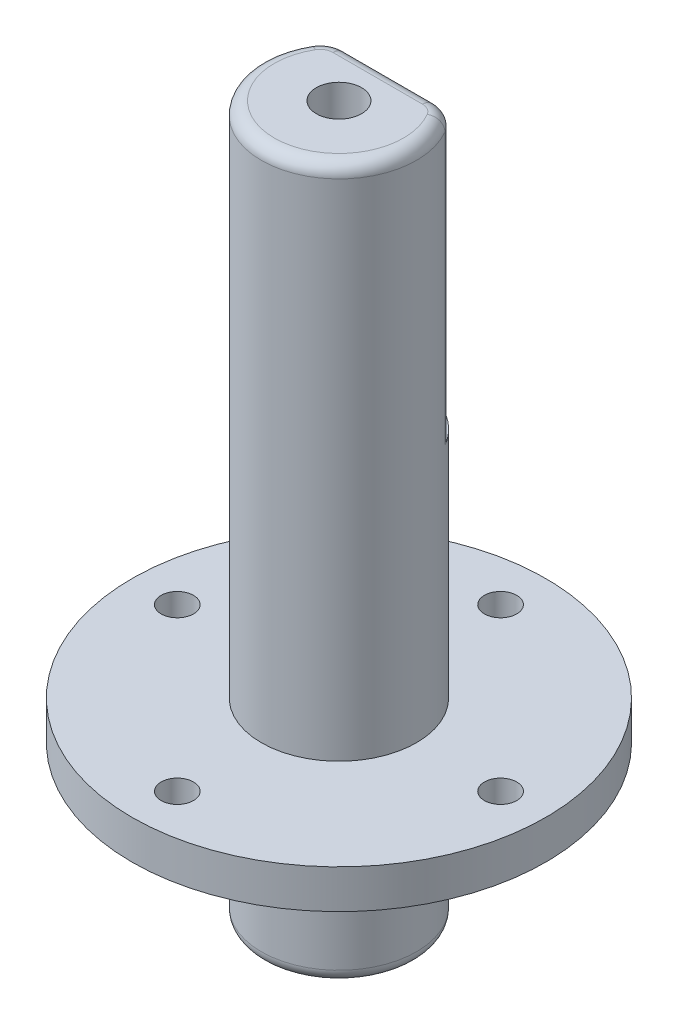
ISO-10303-21;
HEADER;
FILE_DESCRIPTION(('STEP AP214'),'2;1');
FILE_NAME('part.step','',(''),(''),'','','');
FILE_SCHEMA(('AUTOMOTIVE_DESIGN { 1 0 10303 214 1 1 1 1 }'));
ENDSEC;
DATA;
#1=APPLICATION_CONTEXT('core data for automotive mechanical design processes');
#2=APPLICATION_PROTOCOL_DEFINITION('international standard','automotive_design',2000,#1);
#3=PRODUCT_CONTEXT('',#1,'mechanical');
#4=PRODUCT('Part','Part','',(#3));
#5=PRODUCT_RELATED_PRODUCT_CATEGORY('part','',(#4));
#6=PRODUCT_DEFINITION_FORMATION('','',#4);
#7=PRODUCT_DEFINITION_CONTEXT('part definition',#1,'design');
#8=PRODUCT_DEFINITION('design','',#6,#7);
#9=PRODUCT_DEFINITION_SHAPE('','',#8);
#10=(LENGTH_UNIT() NAMED_UNIT(*) SI_UNIT(.MILLI.,.METRE.));
#11=(NAMED_UNIT(*) PLANE_ANGLE_UNIT() SI_UNIT($,.RADIAN.));
#12=(NAMED_UNIT(*) SI_UNIT($,.STERADIAN.) SOLID_ANGLE_UNIT());
#13=UNCERTAINTY_MEASURE_WITH_UNIT(LENGTH_MEASURE(1.E-05),#10,'distance_accuracy_value','');
#14=(GEOMETRIC_REPRESENTATION_CONTEXT(3) GLOBAL_UNCERTAINTY_ASSIGNED_CONTEXT((#13)) GLOBAL_UNIT_ASSIGNED_CONTEXT((#10,
#11,#12)) REPRESENTATION_CONTEXT('',''));
#15=CARTESIAN_POINT('',(0.,0.,0.));
#16=DIRECTION('',(0.,0.,1.));
#17=DIRECTION('',(1.,0.,0.));
#18=AXIS2_PLACEMENT_3D('',#15,#16,#17);
#19=CARTESIAN_POINT('',(0.,10.,0.));
#20=DIRECTION('',(0.,-1.,0.));
#21=DIRECTION('',(0.,0.,-1.));
#22=AXIS2_PLACEMENT_3D('',#19,#20,#21);
#23=CYLINDRICAL_SURFACE('',#22,6.);
#24=CARTESIAN_POINT('',(0.,0.999999999999999,0.));
#25=DIRECTION('',(0.,1.,0.));
#26=DIRECTION('',(0.,0.,1.));
#27=AXIS2_PLACEMENT_3D('',#24,#25,#26);
#28=CIRCLE('',#27,6.);
#29=CARTESIAN_POINT('',(0.,0.999999999999999,6.));
#30=VERTEX_POINT('',#29);
#31=EDGE_CURVE('E171',#30,#30,#28,.T.);
#32=ORIENTED_EDGE('',*,*,#31,.T.);
#33=EDGE_LOOP('',(#32));
#34=FACE_BOUND('',#33,.T.);
#35=CARTESIAN_POINT('',(0.,10.,0.));
#36=DIRECTION('',(0.,1.,0.));
#37=DIRECTION('',(0.,0.,1.));
#38=AXIS2_PLACEMENT_3D('',#35,#36,#37);
#39=CIRCLE('',#38,6.);
#40=CARTESIAN_POINT('',(0.,10.,6.));
#41=VERTEX_POINT('',#40);
#42=EDGE_CURVE('E172',#41,#41,#39,.T.);
#43=ORIENTED_EDGE('',*,*,#42,.F.);
#44=EDGE_LOOP('',(#43));
#45=FACE_BOUND('',#44,.T.);
#46=ADVANCED_FACE('F35',(#34,#45),#23,.T.);
#47=CARTESIAN_POINT('',(0.,0.,0.));
#48=DIRECTION('',(0.,1.,0.));
#49=DIRECTION('',(0.,0.,1.));
#50=AXIS2_PLACEMENT_3D('',#47,#48,#49);
#51=PLANE('',#50);
#52=CARTESIAN_POINT('',(0.,0.,0.));
#53=DIRECTION('',(0.,1.,0.));
#54=DIRECTION('',(0.,0.,1.));
#55=AXIS2_PLACEMENT_3D('',#52,#53,#54);
#56=CIRCLE('',#55,5.);
#57=CARTESIAN_POINT('',(0.,0.,5.));
#58=VERTEX_POINT('',#57);
#59=EDGE_CURVE('E101',#58,#58,#56,.F.);
#60=ORIENTED_EDGE('',*,*,#59,.T.);
#61=EDGE_LOOP('',(#60));
#62=FACE_BOUND('',#61,.T.);
#63=ADVANCED_FACE('F224',(#62),#51,.F.);
#64=CARTESIAN_POINT('',(0.,12.,0.));
#65=DIRECTION('',(0.,-1.,0.));
#66=DIRECTION('',(0.,0.,-1.));
#67=AXIS2_PLACEMENT_3D('',#64,#65,#66);
#68=CYLINDRICAL_SURFACE('',#67,10.);
#69=CARTESIAN_POINT('',(0.,12.,0.));
#70=DIRECTION('',(0.,1.,0.));
#71=DIRECTION('',(0.,0.,1.));
#72=AXIS2_PLACEMENT_3D('',#69,#70,#71);
#73=CIRCLE('',#72,10.);
#74=CARTESIAN_POINT('',(0.,12.,10.));
#75=VERTEX_POINT('',#74);
#76=EDGE_CURVE('E179',#75,#75,#73,.T.);
#77=ORIENTED_EDGE('',*,*,#76,.F.);
#78=EDGE_LOOP('',(#77));
#79=FACE_BOUND('',#78,.T.);
#80=CARTESIAN_POINT('',(0.,10.,0.));
#81=DIRECTION('',(0.,1.,0.));
#82=DIRECTION('',(0.,0.,1.));
#83=AXIS2_PLACEMENT_3D('',#80,#81,#82);
#84=CIRCLE('',#83,10.);
#85=CARTESIAN_POINT('',(0.,10.,10.));
#86=VERTEX_POINT('',#85);
#87=EDGE_CURVE('E176',#86,#86,#84,.T.);
#88=ORIENTED_EDGE('',*,*,#87,.T.);
#89=EDGE_LOOP('',(#88));
#90=FACE_BOUND('',#89,.T.);
#91=ADVANCED_FACE('F231',(#79,#90),#68,.T.);
#92=CARTESIAN_POINT('',(0.,10.,0.));
#93=DIRECTION('',(0.,1.,0.));
#94=DIRECTION('',(0.,0.,1.));
#95=AXIS2_PLACEMENT_3D('',#92,#93,#94);
#96=PLANE('',#95);
#97=ORIENTED_EDGE('',*,*,#42,.T.);
#98=EDGE_LOOP('',(#97));
#99=FACE_BOUND('',#98,.T.);
#100=ORIENTED_EDGE('',*,*,#87,.F.);
#101=EDGE_LOOP('',(#100));
#102=FACE_BOUND('',#101,.T.);
#103=ADVANCED_FACE('F293',(#99,#102),#96,.F.);
#104=CARTESIAN_POINT('',(0.,15.,0.));
#105=DIRECTION('',(0.,-1.,0.));
#106=DIRECTION('',(0.,0.,-1.));
#107=AXIS2_PLACEMENT_3D('',#104,#105,#106);
#108=CYLINDRICAL_SURFACE('',#107,16.);
#109=CARTESIAN_POINT('',(0.,15.,0.));
#110=DIRECTION('',(0.,1.,0.));
#111=DIRECTION('',(0.,0.,1.));
#112=AXIS2_PLACEMENT_3D('',#109,#110,#111);
#113=CIRCLE('',#112,16.);
#114=CARTESIAN_POINT('',(0.,15.,16.));
#115=VERTEX_POINT('',#114);
#116=EDGE_CURVE('E173',#115,#115,#113,.T.);
#117=ORIENTED_EDGE('',*,*,#116,.F.);
#118=EDGE_LOOP('',(#117));
#119=FACE_BOUND('',#118,.T.);
#120=CARTESIAN_POINT('',(0.,12.,0.));
#121=DIRECTION('',(0.,1.,0.));
#122=DIRECTION('',(0.,0.,1.));
#123=AXIS2_PLACEMENT_3D('',#120,#121,#122);
#124=CIRCLE('',#123,16.);
#125=CARTESIAN_POINT('',(0.,12.,16.));
#126=VERTEX_POINT('',#125);
#127=EDGE_CURVE('E167',#126,#126,#124,.T.);
#128=ORIENTED_EDGE('',*,*,#127,.T.);
#129=EDGE_LOOP('',(#128));
#130=FACE_BOUND('',#129,.T.);
#131=ADVANCED_FACE('F299',(#119,#130),#108,.T.);
#132=CARTESIAN_POINT('',(0.,15.,0.));
#133=DIRECTION('',(0.,1.,0.));
#134=DIRECTION('',(0.,0.,1.));
#135=AXIS2_PLACEMENT_3D('',#132,#133,#134);
#136=PLANE('',#135);
#137=CARTESIAN_POINT('',(0.,15.,-12.5));
#138=DIRECTION('',(0.,1.,0.));
#139=DIRECTION('',(0.,0.,1.));
#140=AXIS2_PLACEMENT_3D('',#137,#138,#139);
#141=CIRCLE('',#140,1.25);
#142=CARTESIAN_POINT('',(0.,15.,-11.25));
#143=VERTEX_POINT('',#142);
#144=EDGE_CURVE('E148',#143,#143,#141,.T.);
#145=ORIENTED_EDGE('',*,*,#144,.F.);
#146=EDGE_LOOP('',(#145));
#147=FACE_BOUND('',#146,.T.);
#148=CARTESIAN_POINT('',(12.5,15.,0.));
#149=DIRECTION('',(0.,1.,0.));
#150=DIRECTION('',(0.,0.,1.));
#151=AXIS2_PLACEMENT_3D('',#148,#149,#150);
#152=CIRCLE('',#151,1.25);
#153=CARTESIAN_POINT('',(12.5,15.,1.25));
#154=VERTEX_POINT('',#153);
#155=EDGE_CURVE('E399',#154,#154,#152,.T.);
#156=ORIENTED_EDGE('',*,*,#155,.F.);
#157=EDGE_LOOP('',(#156));
#158=FACE_BOUND('',#157,.T.);
#159=CARTESIAN_POINT('',(0.,15.,12.5));
#160=DIRECTION('',(0.,1.,0.));
#161=DIRECTION('',(0.,0.,1.));
#162=AXIS2_PLACEMENT_3D('',#159,#160,#161);
#163=CIRCLE('',#162,1.25);
#164=CARTESIAN_POINT('',(0.,15.,13.75));
#165=VERTEX_POINT('',#164);
#166=EDGE_CURVE('E402',#165,#165,#163,.T.);
#167=ORIENTED_EDGE('',*,*,#166,.F.);
#168=EDGE_LOOP('',(#167));
#169=FACE_BOUND('',#168,.T.);
#170=CARTESIAN_POINT('',(-12.5,15.,0.));
#171=DIRECTION('',(0.,1.,0.));
#172=DIRECTION('',(0.,0.,1.));
#173=AXIS2_PLACEMENT_3D('',#170,#171,#172);
#174=CIRCLE('',#173,1.25);
#175=CARTESIAN_POINT('',(-12.5,15.,1.25));
#176=VERTEX_POINT('',#175);
#177=EDGE_CURVE('E406',#176,#176,#174,.T.);
#178=ORIENTED_EDGE('',*,*,#177,.F.);
#179=EDGE_LOOP('',(#178));
#180=FACE_BOUND('',#179,.T.);
#181=CARTESIAN_POINT('',(0.,15.,0.));
#182=DIRECTION('',(0.,1.,0.));
#183=DIRECTION('',(0.,0.,1.));
#184=AXIS2_PLACEMENT_3D('',#181,#182,#183);
#185=CIRCLE('',#184,6.);
#186=CARTESIAN_POINT('',(0.,15.,6.));
#187=VERTEX_POINT('',#186);
#188=EDGE_CURVE('E168',#187,#187,#185,.T.);
#189=ORIENTED_EDGE('',*,*,#188,.F.);
#190=EDGE_LOOP('',(#189));
#191=FACE_BOUND('',#190,.T.);
#192=ORIENTED_EDGE('',*,*,#116,.T.);
#193=EDGE_LOOP('',(#192));
#194=FACE_BOUND('',#193,.T.);
#195=ADVANCED_FACE('F306',(#147,#158,#169,#180,#191,#194),#136,.T.);
#196=CARTESIAN_POINT('',(0.,12.,0.));
#197=DIRECTION('',(0.,1.,0.));
#198=DIRECTION('',(0.,0.,1.));
#199=AXIS2_PLACEMENT_3D('',#196,#197,#198);
#200=PLANE('',#199);
#201=CARTESIAN_POINT('',(0.,12.,-12.5));
#202=DIRECTION('',(0.,1.,0.));
#203=DIRECTION('',(0.,0.,1.));
#204=AXIS2_PLACEMENT_3D('',#201,#202,#203);
#205=CIRCLE('',#204,1.25);
#206=CARTESIAN_POINT('',(0.,12.,-11.25));
#207=VERTEX_POINT('',#206);
#208=EDGE_CURVE('E39',#207,#207,#205,.T.);
#209=ORIENTED_EDGE('',*,*,#208,.T.);
#210=EDGE_LOOP('',(#209));
#211=FACE_BOUND('',#210,.T.);
#212=CARTESIAN_POINT('',(12.5,12.,0.));
#213=DIRECTION('',(0.,1.,0.));
#214=DIRECTION('',(0.,0.,1.));
#215=AXIS2_PLACEMENT_3D('',#212,#213,#214);
#216=CIRCLE('',#215,1.25);
#217=CARTESIAN_POINT('',(12.5,12.,1.25));
#218=VERTEX_POINT('',#217);
#219=EDGE_CURVE('E150',#218,#218,#216,.T.);
#220=ORIENTED_EDGE('',*,*,#219,.T.);
#221=EDGE_LOOP('',(#220));
#222=FACE_BOUND('',#221,.T.);
#223=CARTESIAN_POINT('',(0.,12.,12.5));
#224=DIRECTION('',(0.,1.,0.));
#225=DIRECTION('',(0.,0.,1.));
#226=AXIS2_PLACEMENT_3D('',#223,#224,#225);
#227=CIRCLE('',#226,1.25);
#228=CARTESIAN_POINT('',(0.,12.,13.75));
#229=VERTEX_POINT('',#228);
#230=EDGE_CURVE('E147',#229,#229,#227,.T.);
#231=ORIENTED_EDGE('',*,*,#230,.T.);
#232=EDGE_LOOP('',(#231));
#233=FACE_BOUND('',#232,.T.);
#234=CARTESIAN_POINT('',(-12.5,12.,0.));
#235=DIRECTION('',(0.,1.,0.));
#236=DIRECTION('',(0.,0.,1.));
#237=AXIS2_PLACEMENT_3D('',#234,#235,#236);
#238=CIRCLE('',#237,1.25);
#239=CARTESIAN_POINT('',(-12.5,12.,1.25));
#240=VERTEX_POINT('',#239);
#241=EDGE_CURVE('E144',#240,#240,#238,.T.);
#242=ORIENTED_EDGE('',*,*,#241,.T.);
#243=EDGE_LOOP('',(#242));
#244=FACE_BOUND('',#243,.T.);
#245=ORIENTED_EDGE('',*,*,#76,.T.);
#246=EDGE_LOOP('',(#245));
#247=FACE_BOUND('',#246,.T.);
#248=ORIENTED_EDGE('',*,*,#127,.F.);
#249=EDGE_LOOP('',(#248));
#250=FACE_BOUND('',#249,.T.);
#251=ADVANCED_FACE('F220',(#211,#222,#233,#244,#247,#250),#200,.F.);
#252=CARTESIAN_POINT('',(0.,55.,0.));
#253=DIRECTION('',(0.,-1.,0.));
#254=DIRECTION('',(0.,0.,-1.));
#255=AXIS2_PLACEMENT_3D('',#252,#253,#254);
#256=CYLINDRICAL_SURFACE('',#255,6.);
#257=DIRECTION('',(0.,-1.,0.));
#258=VECTOR('',#257,1.);
#259=CARTESIAN_POINT('',(5.19615242270663,55.,-3.));
#260=LINE('',#259,#258);
#261=CARTESIAN_POINT('',(5.19615242270663,33.,-3.));
#262=VERTEX_POINT('',#261);
#263=CARTESIAN_POINT('',(5.19615242270663,54.,-3.));
#264=VERTEX_POINT('',#263);
#265=EDGE_CURVE('E100',#262,#264,#260,.F.);
#266=ORIENTED_EDGE('',*,*,#265,.T.);
#267=CARTESIAN_POINT('',(0.,54.,0.));
#268=DIRECTION('',(0.,1.,0.));
#269=DIRECTION('',(0.,0.,1.));
#270=AXIS2_PLACEMENT_3D('',#267,#268,#269);
#271=CIRCLE('',#270,6.);
#272=CARTESIAN_POINT('',(-5.19615242270663,54.,-3.));
#273=VERTEX_POINT('',#272);
#274=EDGE_CURVE('E11',#264,#273,#271,.F.);
#275=ORIENTED_EDGE('',*,*,#274,.T.);
#276=DIRECTION('',(0.,-1.,0.));
#277=VECTOR('',#276,1.);
#278=CARTESIAN_POINT('',(-5.19615242270663,55.,-3.));
#279=LINE('',#278,#277);
#280=CARTESIAN_POINT('',(-5.19615242270663,33.,-3.));
#281=VERTEX_POINT('',#280);
#282=EDGE_CURVE('E89',#273,#281,#279,.T.);
#283=ORIENTED_EDGE('',*,*,#282,.T.);
#284=CARTESIAN_POINT('',(0.,33.,0.));
#285=DIRECTION('',(0.,1.,0.));
#286=DIRECTION('',(0.,0.,1.));
#287=AXIS2_PLACEMENT_3D('',#284,#285,#286);
#288=CIRCLE('',#287,6.);
#289=EDGE_CURVE('E93',#262,#281,#288,.T.);
#290=ORIENTED_EDGE('',*,*,#289,.F.);
#291=EDGE_LOOP('',(#266,#275,#283,#290));
#292=FACE_BOUND('',#291,.T.);
#293=ORIENTED_EDGE('',*,*,#188,.T.);
#294=EDGE_LOOP('',(#293));
#295=FACE_BOUND('',#294,.T.);
#296=ADVANCED_FACE('F91',(#292,#295),#256,.T.);
#297=CARTESIAN_POINT('',(0.,55.,0.));
#298=DIRECTION('',(0.,1.,0.));
#299=DIRECTION('',(0.,0.,1.));
#300=AXIS2_PLACEMENT_3D('',#297,#298,#299);
#301=PLANE('',#300);
#302=CARTESIAN_POINT('',(0.,55.,0.));
#303=DIRECTION('',(0.,1.,0.));
#304=DIRECTION('',(0.,0.,1.));
#305=AXIS2_PLACEMENT_3D('',#302,#303,#304);
#306=CIRCLE('',#305,1.75);
#307=CARTESIAN_POINT('',(0.,55.,1.75));
#308=VERTEX_POINT('',#307);
#309=EDGE_CURVE('E155',#308,#308,#306,.T.);
#310=ORIENTED_EDGE('',*,*,#309,.F.);
#311=EDGE_LOOP('',(#310));
#312=FACE_BOUND('',#311,.T.);
#313=DIRECTION('',(1.,0.,0.));
#314=VECTOR('',#313,1.);
#315=CARTESIAN_POINT('',(-3.46410161513776,55.,-3.));
#316=LINE('',#315,#314);
#317=CARTESIAN_POINT('',(3.46410161513776,55.,-3.));
#318=VERTEX_POINT('',#317);
#319=CARTESIAN_POINT('',(-3.46410161513776,55.,-3.));
#320=VERTEX_POINT('',#319);
#321=EDGE_CURVE('E125',#318,#320,#316,.F.);
#322=ORIENTED_EDGE('',*,*,#321,.T.);
#323=CARTESIAN_POINT('',(-3.46410161513776,55.,-2.));
#324=DIRECTION('',(0.,1.,0.));
#325=DIRECTION('',(0.,0.,1.));
#326=AXIS2_PLACEMENT_3D('',#323,#324,#325);
#327=CIRCLE('',#326,1.);
#328=CARTESIAN_POINT('',(-4.3301270189222,55.,-2.5));
#329=VERTEX_POINT('',#328);
#330=EDGE_CURVE('E127',#320,#329,#327,.T.);
#331=ORIENTED_EDGE('',*,*,#330,.T.);
#332=CARTESIAN_POINT('',(0.,55.,0.));
#333=DIRECTION('',(0.,1.,0.));
#334=DIRECTION('',(0.,0.,1.));
#335=AXIS2_PLACEMENT_3D('',#332,#333,#334);
#336=CIRCLE('',#335,5.);
#337=CARTESIAN_POINT('',(4.3301270189222,55.,-2.5));
#338=VERTEX_POINT('',#337);
#339=EDGE_CURVE('E116',#329,#338,#336,.T.);
#340=ORIENTED_EDGE('',*,*,#339,.T.);
#341=CARTESIAN_POINT('',(3.46410161513776,55.,-2.));
#342=DIRECTION('',(0.,1.,0.));
#343=DIRECTION('',(0.,0.,1.));
#344=AXIS2_PLACEMENT_3D('',#341,#342,#343);
#345=CIRCLE('',#344,1.);
#346=EDGE_CURVE('E118',#338,#318,#345,.T.);
#347=ORIENTED_EDGE('',*,*,#346,.T.);
#348=EDGE_LOOP('',(#322,#331,#340,#347));
#349=FACE_BOUND('',#348,.T.);
#350=ADVANCED_FACE('F209',(#312,#349),#301,.T.);
#351=CARTESIAN_POINT('',(0.,0.999999999999999,0.));
#352=DIRECTION('',(0.,1.,0.));
#353=DIRECTION('',(0.,0.,1.));
#354=AXIS2_PLACEMENT_3D('',#351,#352,#353);
#355=TOROIDAL_SURFACE('',#354,5.,1.);
#356=ORIENTED_EDGE('',*,*,#59,.F.);
#357=EDGE_LOOP('',(#356));
#358=FACE_BOUND('',#357,.T.);
#359=ORIENTED_EDGE('',*,*,#31,.F.);
#360=EDGE_LOOP('',(#359));
#361=FACE_BOUND('',#360,.T.);
#362=ADVANCED_FACE('F211',(#358,#361),#355,.T.);
#363=CARTESIAN_POINT('',(-4.47213595499958,33.,-4.));
#364=DIRECTION('',(0.,0.,1.));
#365=DIRECTION('',(1.,0.,0.));
#366=AXIS2_PLACEMENT_3D('',#363,#364,#365);
#367=PLANE('',#366);
#368=DIRECTION('',(0.,-1.,0.));
#369=VECTOR('',#368,1.);
#370=CARTESIAN_POINT('',(-3.46410161513776,33.,-4.));
#371=LINE('',#370,#369);
#372=CARTESIAN_POINT('',(-3.46410161513776,33.,-4.));
#373=VERTEX_POINT('',#372);
#374=CARTESIAN_POINT('',(-3.46410161513776,54.,-4.));
#375=VERTEX_POINT('',#374);
#376=EDGE_CURVE('E115',#373,#375,#371,.F.);
#377=ORIENTED_EDGE('',*,*,#376,.T.);
#378=DIRECTION('',(1.,0.,0.));
#379=VECTOR('',#378,1.);
#380=CARTESIAN_POINT('',(3.46410161513775,54.,-4.));
#381=LINE('',#380,#379);
#382=CARTESIAN_POINT('',(3.46410161513776,54.,-4.));
#383=VERTEX_POINT('',#382);
#384=EDGE_CURVE('E59',#375,#383,#381,.T.);
#385=ORIENTED_EDGE('',*,*,#384,.T.);
#386=DIRECTION('',(0.,-1.,0.));
#387=VECTOR('',#386,1.);
#388=CARTESIAN_POINT('',(3.46410161513776,33.,-4.));
#389=LINE('',#388,#387);
#390=CARTESIAN_POINT('',(3.46410161513775,33.,-4.));
#391=VERTEX_POINT('',#390);
#392=EDGE_CURVE('E120',#383,#391,#389,.T.);
#393=ORIENTED_EDGE('',*,*,#392,.T.);
#394=DIRECTION('',(1.,0.,0.));
#395=VECTOR('',#394,1.);
#396=CARTESIAN_POINT('',(-4.47213595499958,33.,-4.));
#397=LINE('',#396,#395);
#398=EDGE_CURVE('E110',#373,#391,#397,.T.);
#399=ORIENTED_EDGE('',*,*,#398,.F.);
#400=EDGE_LOOP('',(#377,#385,#393,#399));
#401=FACE_BOUND('',#400,.T.);
#402=ADVANCED_FACE('F191',(#401),#367,.F.);
#403=CARTESIAN_POINT('',(0.,33.,0.));
#404=DIRECTION('',(0.,1.,0.));
#405=DIRECTION('',(0.,0.,1.));
#406=AXIS2_PLACEMENT_3D('',#403,#404,#405);
#407=PLANE('',#406);
#408=ORIENTED_EDGE('',*,*,#289,.T.);
#409=CARTESIAN_POINT('',(-3.46410161513776,33.,-2.));
#410=DIRECTION('',(0.,1.,0.));
#411=DIRECTION('',(0.,0.,1.));
#412=AXIS2_PLACEMENT_3D('',#409,#410,#411);
#413=CIRCLE('',#412,2.);
#414=EDGE_CURVE('E106',#281,#373,#413,.F.);
#415=ORIENTED_EDGE('',*,*,#414,.T.);
#416=ORIENTED_EDGE('',*,*,#398,.T.);
#417=CARTESIAN_POINT('',(3.46410161513776,33.,-2.));
#418=DIRECTION('',(0.,1.,0.));
#419=DIRECTION('',(0.,0.,1.));
#420=AXIS2_PLACEMENT_3D('',#417,#418,#419);
#421=CIRCLE('',#420,2.);
#422=EDGE_CURVE('E109',#391,#262,#421,.F.);
#423=ORIENTED_EDGE('',*,*,#422,.T.);
#424=EDGE_LOOP('',(#408,#415,#416,#423));
#425=FACE_BOUND('',#424,.T.);
#426=ADVANCED_FACE('F104',(#425),#407,.T.);
#427=CARTESIAN_POINT('',(3.46410161513776,55.,-2.));
#428=DIRECTION('',(0.,-1.,0.));
#429=DIRECTION('',(0.,0.,-1.));
#430=AXIS2_PLACEMENT_3D('',#427,#428,#429);
#431=CYLINDRICAL_SURFACE('',#430,2.);
#432=ORIENTED_EDGE('',*,*,#392,.F.);
#433=CARTESIAN_POINT('',(3.46410161513776,54.,-2.));
#434=DIRECTION('',(0.,1.,0.));
#435=DIRECTION('',(0.,0.,1.));
#436=AXIS2_PLACEMENT_3D('',#433,#434,#435);
#437=CIRCLE('',#436,2.);
#438=EDGE_CURVE('E44',#383,#264,#437,.F.);
#439=ORIENTED_EDGE('',*,*,#438,.T.);
#440=ORIENTED_EDGE('',*,*,#265,.F.);
#441=ORIENTED_EDGE('',*,*,#422,.F.);
#442=EDGE_LOOP('',(#432,#439,#440,#441));
#443=FACE_BOUND('',#442,.T.);
#444=ADVANCED_FACE('F192',(#443),#431,.T.);
#445=CARTESIAN_POINT('',(-3.46410161513776,55.,-2.));
#446=DIRECTION('',(0.,-1.,0.));
#447=DIRECTION('',(0.,0.,-1.));
#448=AXIS2_PLACEMENT_3D('',#445,#446,#447);
#449=CYLINDRICAL_SURFACE('',#448,2.);
#450=ORIENTED_EDGE('',*,*,#282,.F.);
#451=CARTESIAN_POINT('',(-3.46410161513776,54.,-2.));
#452=DIRECTION('',(0.,1.,0.));
#453=DIRECTION('',(0.,0.,1.));
#454=AXIS2_PLACEMENT_3D('',#451,#452,#453);
#455=CIRCLE('',#454,2.);
#456=EDGE_CURVE('E130',#273,#375,#455,.F.);
#457=ORIENTED_EDGE('',*,*,#456,.T.);
#458=ORIENTED_EDGE('',*,*,#376,.F.);
#459=ORIENTED_EDGE('',*,*,#414,.F.);
#460=EDGE_LOOP('',(#450,#457,#458,#459));
#461=FACE_BOUND('',#460,.T.);
#462=ADVANCED_FACE('F114',(#461),#449,.T.);
#463=CARTESIAN_POINT('',(3.46410161513776,54.,-2.));
#464=DIRECTION('',(0.,1.,0.));
#465=DIRECTION('',(0.,0.,1.));
#466=AXIS2_PLACEMENT_3D('',#463,#464,#465);
#467=DEGENERATE_TOROIDAL_SURFACE('',#466,1.,1.,.T.);
#468=CARTESIAN_POINT('',(4.3301270189222,54.,-2.5));
#469=DIRECTION('',(0.5,0.,0.866025403784438));
#470=DIRECTION('',(0.866025403784439,0.,-0.5));
#471=AXIS2_PLACEMENT_3D('',#468,#469,#470);
#472=CIRCLE('',#471,1.);
#473=EDGE_CURVE('E139',#264,#338,#472,.T.);
#474=ORIENTED_EDGE('',*,*,#473,.F.);
#475=ORIENTED_EDGE('',*,*,#438,.F.);
#476=CARTESIAN_POINT('',(3.46410161513776,54.,-3.));
#477=DIRECTION('',(-1.,0.,0.));
#478=DIRECTION('',(0.,0.,1.));
#479=AXIS2_PLACEMENT_3D('',#476,#477,#478);
#480=CIRCLE('',#479,1.);
#481=EDGE_CURVE('E111',#318,#383,#480,.T.);
#482=ORIENTED_EDGE('',*,*,#481,.F.);
#483=ORIENTED_EDGE('',*,*,#346,.F.);
#484=EDGE_LOOP('',(#474,#475,#482,#483));
#485=FACE_BOUND('',#484,.T.);
#486=ADVANCED_FACE('F37',(#485),#467,.T.);
#487=CARTESIAN_POINT('',(-4.47213595499958,54.,-3.));
#488=DIRECTION('',(-1.,0.,0.));
#489=DIRECTION('',(0.,0.,1.));
#490=AXIS2_PLACEMENT_3D('',#487,#488,#489);
#491=CYLINDRICAL_SURFACE('',#490,1.);
#492=ORIENTED_EDGE('',*,*,#481,.T.);
#493=ORIENTED_EDGE('',*,*,#384,.F.);
#494=CARTESIAN_POINT('',(-3.46410161513776,54.,-3.));
#495=DIRECTION('',(-1.,0.,0.));
#496=DIRECTION('',(0.,0.,1.));
#497=AXIS2_PLACEMENT_3D('',#494,#495,#496);
#498=CIRCLE('',#497,1.);
#499=EDGE_CURVE('E136',#320,#375,#498,.T.);
#500=ORIENTED_EDGE('',*,*,#499,.F.);
#501=ORIENTED_EDGE('',*,*,#321,.F.);
#502=EDGE_LOOP('',(#492,#493,#500,#501));
#503=FACE_BOUND('',#502,.T.);
#504=ADVANCED_FACE('F207',(#503),#491,.T.);
#505=CARTESIAN_POINT('',(0.,54.,0.));
#506=DIRECTION('',(0.,1.,0.));
#507=DIRECTION('',(0.,0.,1.));
#508=AXIS2_PLACEMENT_3D('',#505,#506,#507);
#509=TOROIDAL_SURFACE('',#508,5.,1.);
#510=ORIENTED_EDGE('',*,*,#473,.T.);
#511=ORIENTED_EDGE('',*,*,#339,.F.);
#512=CARTESIAN_POINT('',(-4.3301270189222,54.,-2.5));
#513=DIRECTION('',(0.5,0.,-0.866025403784438));
#514=DIRECTION('',(-0.866025403784439,0.,-0.5));
#515=AXIS2_PLACEMENT_3D('',#512,#513,#514);
#516=CIRCLE('',#515,1.);
#517=EDGE_CURVE('E134',#273,#329,#516,.T.);
#518=ORIENTED_EDGE('',*,*,#517,.F.);
#519=ORIENTED_EDGE('',*,*,#274,.F.);
#520=EDGE_LOOP('',(#510,#511,#518,#519));
#521=FACE_BOUND('',#520,.T.);
#522=ADVANCED_FACE('F200',(#521),#509,.T.);
#523=CARTESIAN_POINT('',(-3.46410161513776,54.,-2.));
#524=DIRECTION('',(0.,1.,0.));
#525=DIRECTION('',(0.,0.,1.));
#526=AXIS2_PLACEMENT_3D('',#523,#524,#525);
#527=DEGENERATE_TOROIDAL_SURFACE('',#526,1.,1.,.T.);
#528=ORIENTED_EDGE('',*,*,#499,.T.);
#529=ORIENTED_EDGE('',*,*,#456,.F.);
#530=ORIENTED_EDGE('',*,*,#517,.T.);
#531=ORIENTED_EDGE('',*,*,#330,.F.);
#532=EDGE_LOOP('',(#528,#529,#530,#531));
#533=FACE_BOUND('',#532,.T.);
#534=ADVANCED_FACE('F203',(#533),#527,.T.);
#535=CARTESIAN_POINT('',(0.,35.,0.));
#536=DIRECTION('',(0.,1.,0.));
#537=DIRECTION('',(0.,0.,1.));
#538=AXIS2_PLACEMENT_3D('',#535,#536,#537);
#539=CYLINDRICAL_SURFACE('',#538,1.75);
#540=CARTESIAN_POINT('',(0.,35.,0.));
#541=DIRECTION('',(0.,1.,0.));
#542=DIRECTION('',(0.,0.,1.));
#543=AXIS2_PLACEMENT_3D('',#540,#541,#542);
#544=CIRCLE('',#543,1.75);
#545=CARTESIAN_POINT('',(0.,35.,1.75));
#546=VERTEX_POINT('',#545);
#547=EDGE_CURVE('E137',#546,#546,#544,.T.);
#548=ORIENTED_EDGE('',*,*,#547,.F.);
#549=EDGE_LOOP('',(#548));
#550=FACE_BOUND('',#549,.T.);
#551=ORIENTED_EDGE('',*,*,#309,.T.);
#552=EDGE_LOOP('',(#551));
#553=FACE_BOUND('',#552,.T.);
#554=ADVANCED_FACE('F243',(#550,#553),#539,.F.);
#555=CARTESIAN_POINT('',(0.,35.,0.));
#556=DIRECTION('',(0.,1.,0.));
#557=DIRECTION('',(0.,0.,1.));
#558=AXIS2_PLACEMENT_3D('',#555,#556,#557);
#559=PLANE('',#558);
#560=ORIENTED_EDGE('',*,*,#547,.T.);
#561=EDGE_LOOP('',(#560));
#562=FACE_BOUND('',#561,.T.);
#563=ADVANCED_FACE('F343',(#562),#559,.T.);
#564=CARTESIAN_POINT('',(-12.5,8.,0.));
#565=DIRECTION('',(0.,1.,0.));
#566=DIRECTION('',(0.,0.,1.));
#567=AXIS2_PLACEMENT_3D('',#564,#565,#566);
#568=CYLINDRICAL_SURFACE('',#567,1.25);
#569=ORIENTED_EDGE('',*,*,#177,.T.);
#570=EDGE_LOOP('',(#569));
#571=FACE_BOUND('',#570,.T.);
#572=ORIENTED_EDGE('',*,*,#241,.F.);
#573=EDGE_LOOP('',(#572));
#574=FACE_BOUND('',#573,.T.);
#575=ADVANCED_FACE('F352',(#571,#574),#568,.F.);
#576=CARTESIAN_POINT('',(0.,8.,12.5));
#577=DIRECTION('',(0.,1.,0.));
#578=DIRECTION('',(0.,0.,1.));
#579=AXIS2_PLACEMENT_3D('',#576,#577,#578);
#580=CYLINDRICAL_SURFACE('',#579,1.25);
#581=ORIENTED_EDGE('',*,*,#166,.T.);
#582=EDGE_LOOP('',(#581));
#583=FACE_BOUND('',#582,.T.);
#584=ORIENTED_EDGE('',*,*,#230,.F.);
#585=EDGE_LOOP('',(#584));
#586=FACE_BOUND('',#585,.T.);
#587=ADVANCED_FACE('F362',(#583,#586),#580,.F.);
#588=CARTESIAN_POINT('',(12.5,8.,0.));
#589=DIRECTION('',(0.,1.,0.));
#590=DIRECTION('',(0.,0.,1.));
#591=AXIS2_PLACEMENT_3D('',#588,#589,#590);
#592=CYLINDRICAL_SURFACE('',#591,1.25);
#593=ORIENTED_EDGE('',*,*,#155,.T.);
#594=EDGE_LOOP('',(#593));
#595=FACE_BOUND('',#594,.T.);
#596=ORIENTED_EDGE('',*,*,#219,.F.);
#597=EDGE_LOOP('',(#596));
#598=FACE_BOUND('',#597,.T.);
#599=ADVANCED_FACE('F369',(#595,#598),#592,.F.);
#600=CARTESIAN_POINT('',(0.,8.,-12.5));
#601=DIRECTION('',(0.,1.,0.));
#602=DIRECTION('',(0.,0.,1.));
#603=AXIS2_PLACEMENT_3D('',#600,#601,#602);
#604=CYLINDRICAL_SURFACE('',#603,1.25);
#605=ORIENTED_EDGE('',*,*,#144,.T.);
#606=EDGE_LOOP('',(#605));
#607=FACE_BOUND('',#606,.T.);
#608=ORIENTED_EDGE('',*,*,#208,.F.);
#609=EDGE_LOOP('',(#608));
#610=FACE_BOUND('',#609,.T.);
#611=ADVANCED_FACE('F377',(#607,#610),#604,.F.);
#612=CLOSED_SHELL('',(#46,#63,#91,#103,#131,#195,#251,#296,#350,#362,#402,#426,#444,#462,#486,
#504,#522,#534,#554,#563,#575,#587,#599,#611));
#613=MANIFOLD_SOLID_BREP('B2',#612);
#614=ADVANCED_BREP_SHAPE_REPRESENTATION('',(#18,#613),#14);
#615=SHAPE_DEFINITION_REPRESENTATION(#9,#614);
ENDSEC;
END-ISO-10303-21;
